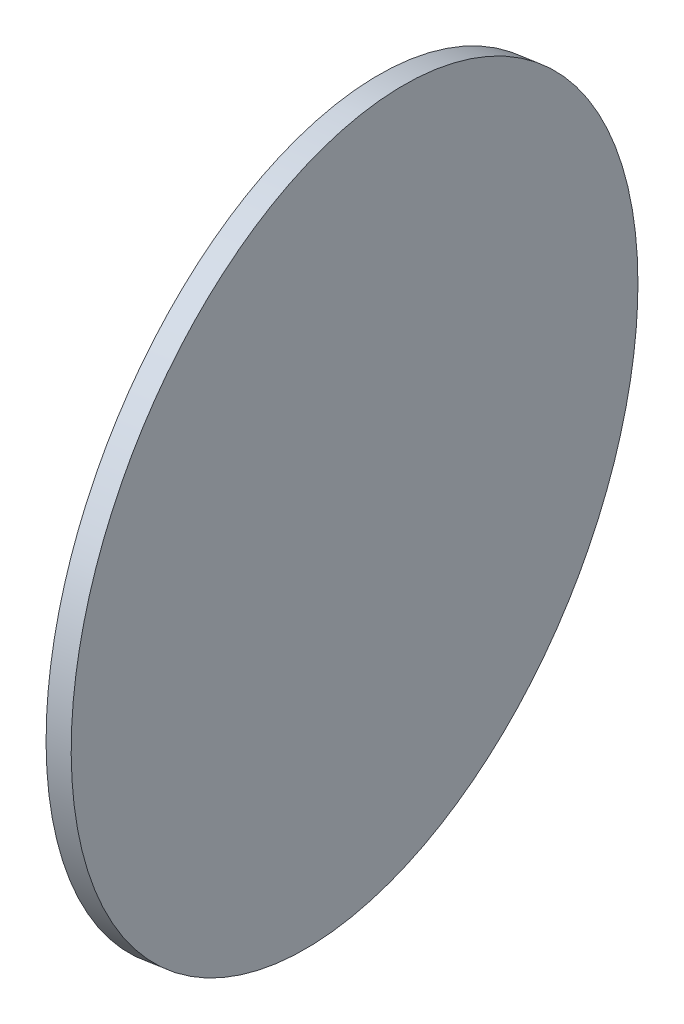
ISO-10303-21;
HEADER;
FILE_DESCRIPTION(('STEP AP214'),'2;1');
FILE_NAME('part.step','',(''),(''),'','','');
FILE_SCHEMA(('AUTOMOTIVE_DESIGN { 1 0 10303 214 1 1 1 1 }'));
ENDSEC;
DATA;
#1=APPLICATION_CONTEXT('core data for automotive mechanical design processes');
#2=APPLICATION_PROTOCOL_DEFINITION('international standard','automotive_design',2000,#1);
#3=PRODUCT_CONTEXT('',#1,'mechanical');
#4=PRODUCT('Part','Part','',(#3));
#5=PRODUCT_RELATED_PRODUCT_CATEGORY('part','',(#4));
#6=PRODUCT_DEFINITION_FORMATION('','',#4);
#7=PRODUCT_DEFINITION_CONTEXT('part definition',#1,'design');
#8=PRODUCT_DEFINITION('design','',#6,#7);
#9=PRODUCT_DEFINITION_SHAPE('','',#8);
#10=(LENGTH_UNIT() NAMED_UNIT(*) SI_UNIT(.MILLI.,.METRE.));
#11=(NAMED_UNIT(*) PLANE_ANGLE_UNIT() SI_UNIT($,.RADIAN.));
#12=(NAMED_UNIT(*) SI_UNIT($,.STERADIAN.) SOLID_ANGLE_UNIT());
#13=UNCERTAINTY_MEASURE_WITH_UNIT(LENGTH_MEASURE(1.E-05),#10,'distance_accuracy_value','');
#14=(GEOMETRIC_REPRESENTATION_CONTEXT(3) GLOBAL_UNCERTAINTY_ASSIGNED_CONTEXT((#13)) GLOBAL_UNIT_ASSIGNED_CONTEXT((#10,
#11,#12)) REPRESENTATION_CONTEXT('',''));
#15=CARTESIAN_POINT('',(0.,0.,0.));
#16=DIRECTION('',(0.,0.,1.));
#17=DIRECTION('',(1.,0.,0.));
#18=AXIS2_PLACEMENT_3D('',#15,#16,#17);
#19=CARTESIAN_POINT('',(0.492403876506104,2.40094450242092E-08,-0.0868240888334619));
#20=DIRECTION('',(0.984807753012208,4.80188900484183E-08,-0.173648177666924));
#21=DIRECTION('',(-0.17364817766693,2.72328658129813E-07,-0.98480775301217));
#22=AXIS2_PLACEMENT_3D('',#19,#20,#21);
#23=ELLIPSE('',#22,16.1107122854598,15.875);
#24=DIRECTION('',(-0.984807753012208,-4.80188900484183E-08,0.173648177666924));
#25=VECTOR('',#24,1.);
#26=SURFACE_OF_LINEAR_EXTRUSION('',#23,#25);
#27=CARTESIAN_POINT('',(-2.30519195278021,4.41141810323896E-06,-15.9527784541027));
#28=VERTEX_POINT('',#27);
#29=EDGE_CURVE('E11',#28,#28,#23,.T.);
#30=ORIENTED_EDGE('',*,*,#29,.F.);
#31=EDGE_LOOP('',(#30));
#32=FACE_BOUND('',#31,.T.);
#33=CARTESIAN_POINT('',(-0.492403876506104,-2.40094450242092E-08,0.0868240888334619));
#34=DIRECTION('',(0.984807753012208,4.80188900484183E-08,-0.173648177666924));
#35=DIRECTION('',(-0.17364817766693,2.72328658129813E-07,-0.98480775301217));
#36=AXIS2_PLACEMENT_3D('',#33,#34,#35);
#37=ELLIPSE('',#36,16.1107122854598,15.875);
#38=CARTESIAN_POINT('',(-3.28999970579242,4.36339921319054E-06,-15.7791302764357));
#39=VERTEX_POINT('',#38);
#40=EDGE_CURVE('E42',#39,#39,#37,.T.);
#41=ORIENTED_EDGE('',*,*,#40,.T.);
#42=EDGE_LOOP('',(#41));
#43=FACE_BOUND('',#42,.T.);
#44=ADVANCED_FACE('F39',(#32,#43),#26,.F.);
#45=CARTESIAN_POINT('',(0.492403876506104,2.40094450242092E-08,-0.0868240888334619));
#46=DIRECTION('',(0.984807753012208,4.80188900484183E-08,-0.173648177666924));
#47=DIRECTION('',(-0.173648177666924,0.,-0.984807753012209));
#48=AXIS2_PLACEMENT_3D('',#45,#46,#47);
#49=PLANE('',#48);
#50=ORIENTED_EDGE('',*,*,#29,.T.);
#51=EDGE_LOOP('',(#50));
#52=FACE_BOUND('',#51,.T.);
#53=ADVANCED_FACE('F56',(#52),#49,.T.);
#54=CARTESIAN_POINT('',(-0.492403876506104,-2.40094450242092E-08,0.0868240888334619));
#55=DIRECTION('',(0.984807753012208,4.80188900484183E-08,-0.173648177666924));
#56=DIRECTION('',(-0.173648177666924,0.,-0.984807753012209));
#57=AXIS2_PLACEMENT_3D('',#54,#55,#56);
#58=PLANE('',#57);
#59=ORIENTED_EDGE('',*,*,#40,.F.);
#60=EDGE_LOOP('',(#59));
#61=FACE_BOUND('',#60,.T.);
#62=ADVANCED_FACE('F54',(#61),#58,.F.);
#63=CLOSED_SHELL('',(#44,#53,#62));
#64=MANIFOLD_SOLID_BREP('B2',#63);
#65=ADVANCED_BREP_SHAPE_REPRESENTATION('',(#18,#64),#14);
#66=SHAPE_DEFINITION_REPRESENTATION(#9,#65);
ENDSEC;
END-ISO-10303-21;
